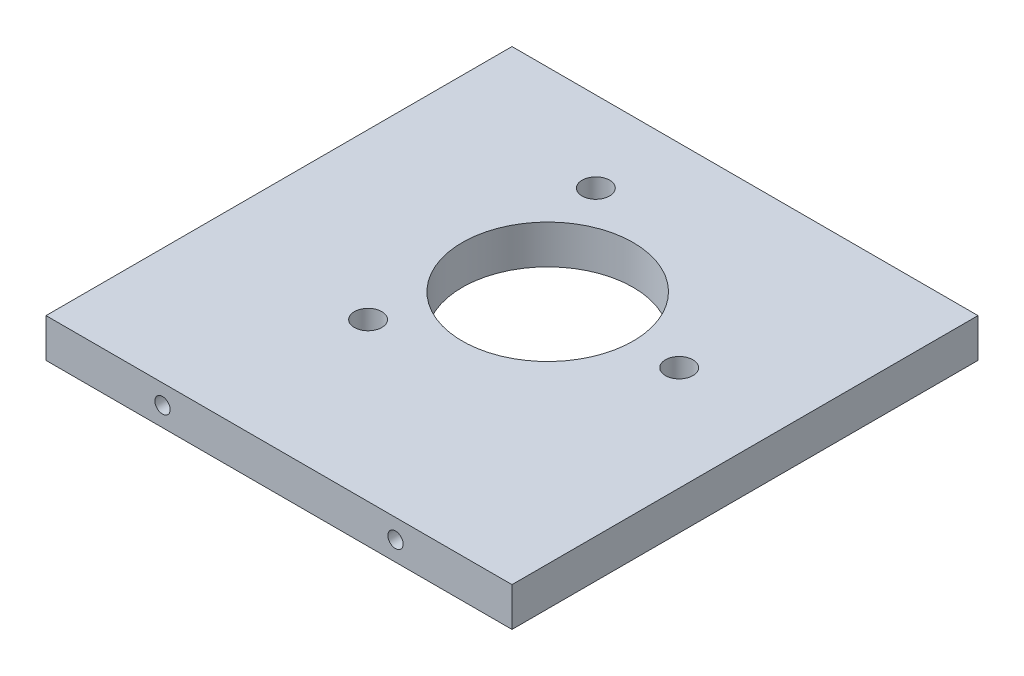
ISO-10303-21;
HEADER;
FILE_DESCRIPTION(('STEP AP214'),'2;1');
FILE_NAME('part.step','',(''),(''),'','','');
FILE_SCHEMA(('AUTOMOTIVE_DESIGN { 1 0 10303 214 1 1 1 1 }'));
ENDSEC;
DATA;
#1=APPLICATION_CONTEXT('core data for automotive mechanical design processes');
#2=APPLICATION_PROTOCOL_DEFINITION('international standard','automotive_design',2000,#1);
#3=PRODUCT_CONTEXT('',#1,'mechanical');
#4=PRODUCT('Part','Part','',(#3));
#5=PRODUCT_RELATED_PRODUCT_CATEGORY('part','',(#4));
#6=PRODUCT_DEFINITION_FORMATION('','',#4);
#7=PRODUCT_DEFINITION_CONTEXT('part definition',#1,'design');
#8=PRODUCT_DEFINITION('design','',#6,#7);
#9=PRODUCT_DEFINITION_SHAPE('','',#8);
#10=(LENGTH_UNIT() NAMED_UNIT(*) SI_UNIT(.MILLI.,.METRE.));
#11=(NAMED_UNIT(*) PLANE_ANGLE_UNIT() SI_UNIT($,.RADIAN.));
#12=(NAMED_UNIT(*) SI_UNIT($,.STERADIAN.) SOLID_ANGLE_UNIT());
#13=UNCERTAINTY_MEASURE_WITH_UNIT(LENGTH_MEASURE(1.E-05),#10,'distance_accuracy_value','');
#14=(GEOMETRIC_REPRESENTATION_CONTEXT(3) GLOBAL_UNCERTAINTY_ASSIGNED_CONTEXT((#13)) GLOBAL_UNIT_ASSIGNED_CONTEXT((#10,
#11,#12)) REPRESENTATION_CONTEXT('',''));
#15=CARTESIAN_POINT('',(0.,0.,0.));
#16=DIRECTION('',(0.,0.,1.));
#17=DIRECTION('',(1.,0.,0.));
#18=AXIS2_PLACEMENT_3D('',#15,#16,#17);
#19=CARTESIAN_POINT('',(-38.1,3.175,76.2));
#20=DIRECTION('',(1.,0.,0.));
#21=DIRECTION('',(0.,0.,-1.));
#22=AXIS2_PLACEMENT_3D('',#19,#20,#21);
#23=PLANE('',#22);
#24=DIRECTION('',(0.,0.,-1.));
#25=VECTOR('',#24,1.);
#26=CARTESIAN_POINT('',(-38.1,3.175,76.2));
#27=LINE('',#26,#25);
#28=CARTESIAN_POINT('',(-38.1,3.175,76.2));
#29=VERTEX_POINT('',#28);
#30=CARTESIAN_POINT('',(-38.1,3.175,0.));
#31=VERTEX_POINT('',#30);
#32=EDGE_CURVE('E150',#29,#31,#27,.T.);
#33=ORIENTED_EDGE('',*,*,#32,.T.);
#34=DIRECTION('',(0.,-1.,0.));
#35=VECTOR('',#34,1.);
#36=CARTESIAN_POINT('',(-38.1,3.175,0.));
#37=LINE('',#36,#35);
#38=CARTESIAN_POINT('',(-38.1,-3.175,0.));
#39=VERTEX_POINT('',#38);
#40=EDGE_CURVE('E51',#31,#39,#37,.T.);
#41=ORIENTED_EDGE('',*,*,#40,.T.);
#42=DIRECTION('',(0.,0.,-1.));
#43=VECTOR('',#42,1.);
#44=CARTESIAN_POINT('',(-38.1,-3.175,76.2));
#45=LINE('',#44,#43);
#46=CARTESIAN_POINT('',(-38.1,-3.175,76.2));
#47=VERTEX_POINT('',#46);
#48=EDGE_CURVE('E11',#47,#39,#45,.T.);
#49=ORIENTED_EDGE('',*,*,#48,.F.);
#50=DIRECTION('',(0.,-1.,0.));
#51=VECTOR('',#50,1.);
#52=CARTESIAN_POINT('',(-38.1,3.175,76.2));
#53=LINE('',#52,#51);
#54=EDGE_CURVE('E141',#29,#47,#53,.T.);
#55=ORIENTED_EDGE('',*,*,#54,.F.);
#56=EDGE_LOOP('',(#33,#41,#49,#55));
#57=FACE_BOUND('',#56,.T.);
#58=ADVANCED_FACE('F37',(#57),#23,.F.);
#59=CARTESIAN_POINT('',(38.1,-3.175,76.2));
#60=DIRECTION('',(0.,1.,0.));
#61=DIRECTION('',(0.,0.,1.));
#62=AXIS2_PLACEMENT_3D('',#59,#60,#61);
#63=PLANE('',#62);
#64=CARTESIAN_POINT('',(-11.2009516410936,-3.175,13.1905201915453));
#65=DIRECTION('',(0.,-1.,0.));
#66=DIRECTION('',(0.,0.,-1.));
#67=AXIS2_PLACEMENT_3D('',#64,#65,#66);
#68=CIRCLE('',#67,4.7);
#69=CARTESIAN_POINT('',(-11.2009516410936,-3.175,8.49052019154533));
#70=VERTEX_POINT('',#69);
#71=EDGE_CURVE('E109',#70,#70,#68,.T.);
#72=ORIENTED_EDGE('',*,*,#71,.F.);
#73=EDGE_LOOP('',(#72));
#74=FACE_BOUND('',#73,.T.);
#75=CARTESIAN_POINT('',(21.0490483589064,-3.175,31.8100663729153));
#76=DIRECTION('',(0.,-1.,0.));
#77=DIRECTION('',(0.,0.,-1.));
#78=AXIS2_PLACEMENT_3D('',#75,#76,#77);
#79=CIRCLE('',#78,4.7);
#80=CARTESIAN_POINT('',(21.0490483589064,-3.175,27.1100663729153));
#81=VERTEX_POINT('',#80);
#82=EDGE_CURVE('E119',#81,#81,#79,.T.);
#83=ORIENTED_EDGE('',*,*,#82,.F.);
#84=EDGE_LOOP('',(#83));
#85=FACE_BOUND('',#84,.T.);
#86=CARTESIAN_POINT('',(-11.2009516410936,-3.175,50.4296125542853));
#87=DIRECTION('',(0.,-1.,0.));
#88=DIRECTION('',(0.,0.,-1.));
#89=AXIS2_PLACEMENT_3D('',#86,#87,#88);
#90=CIRCLE('',#89,4.7);
#91=CARTESIAN_POINT('',(-11.2009516410936,-3.175,45.7296125542853));
#92=VERTEX_POINT('',#91);
#93=EDGE_CURVE('E128',#92,#92,#90,.T.);
#94=ORIENTED_EDGE('',*,*,#93,.F.);
#95=EDGE_LOOP('',(#94));
#96=FACE_BOUND('',#95,.T.);
#97=CARTESIAN_POINT('',(-0.450951641093599,-3.175,31.8100663729154));
#98=DIRECTION('',(0.,-1.,0.));
#99=DIRECTION('',(0.,0.,-1.));
#100=AXIS2_PLACEMENT_3D('',#97,#98,#99);
#101=CIRCLE('',#100,13.9700000001459);
#102=CARTESIAN_POINT('',(-0.450951641093599,-3.175,17.8400663727695));
#103=VERTEX_POINT('',#102);
#104=EDGE_CURVE('E137',#103,#103,#101,.T.);
#105=ORIENTED_EDGE('',*,*,#104,.F.);
#106=EDGE_LOOP('',(#105));
#107=FACE_BOUND('',#106,.T.);
#108=ORIENTED_EDGE('',*,*,#48,.T.);
#109=DIRECTION('',(-1.,0.,0.));
#110=VECTOR('',#109,1.);
#111=CARTESIAN_POINT('',(38.1,-3.175,0.));
#112=LINE('',#111,#110);
#113=CARTESIAN_POINT('',(38.1,-3.175,0.));
#114=VERTEX_POINT('',#113);
#115=EDGE_CURVE('E103',#114,#39,#112,.T.);
#116=ORIENTED_EDGE('',*,*,#115,.F.);
#117=DIRECTION('',(0.,0.,-1.));
#118=VECTOR('',#117,1.);
#119=CARTESIAN_POINT('',(38.1,-3.175,76.2));
#120=LINE('',#119,#118);
#121=CARTESIAN_POINT('',(38.1,-3.175,76.2));
#122=VERTEX_POINT('',#121);
#123=EDGE_CURVE('E44',#122,#114,#120,.T.);
#124=ORIENTED_EDGE('',*,*,#123,.F.);
#125=DIRECTION('',(1.,0.,0.));
#126=VECTOR('',#125,1.);
#127=CARTESIAN_POINT('',(38.1,-3.175,76.2));
#128=LINE('',#127,#126);
#129=EDGE_CURVE('E145',#47,#122,#128,.T.);
#130=ORIENTED_EDGE('',*,*,#129,.F.);
#131=EDGE_LOOP('',(#108,#116,#124,#130));
#132=FACE_BOUND('',#131,.T.);
#133=ADVANCED_FACE('F164',(#74,#85,#96,#107,#132),#63,.F.);
#134=CARTESIAN_POINT('',(38.1,3.175,76.2));
#135=DIRECTION('',(-1.,0.,0.));
#136=DIRECTION('',(0.,0.,1.));
#137=AXIS2_PLACEMENT_3D('',#134,#135,#136);
#138=PLANE('',#137);
#139=ORIENTED_EDGE('',*,*,#123,.T.);
#140=DIRECTION('',(0.,-1.,0.));
#141=VECTOR('',#140,1.);
#142=CARTESIAN_POINT('',(38.1,3.175,0.));
#143=LINE('',#142,#141);
#144=CARTESIAN_POINT('',(38.1,3.175,0.));
#145=VERTEX_POINT('',#144);
#146=EDGE_CURVE('E106',#145,#114,#143,.T.);
#147=ORIENTED_EDGE('',*,*,#146,.F.);
#148=DIRECTION('',(0.,0.,-1.));
#149=VECTOR('',#148,1.);
#150=CARTESIAN_POINT('',(38.1,3.175,76.2));
#151=LINE('',#150,#149);
#152=CARTESIAN_POINT('',(38.1,3.175,76.2));
#153=VERTEX_POINT('',#152);
#154=EDGE_CURVE('E153',#153,#145,#151,.T.);
#155=ORIENTED_EDGE('',*,*,#154,.F.);
#156=DIRECTION('',(0.,1.,0.));
#157=VECTOR('',#156,1.);
#158=CARTESIAN_POINT('',(38.1,3.175,76.2));
#159=LINE('',#158,#157);
#160=EDGE_CURVE('E147',#122,#153,#159,.T.);
#161=ORIENTED_EDGE('',*,*,#160,.F.);
#162=EDGE_LOOP('',(#139,#147,#155,#161));
#163=FACE_BOUND('',#162,.T.);
#164=ADVANCED_FACE('F160',(#163),#138,.F.);
#165=CARTESIAN_POINT('',(38.1,3.175,76.2));
#166=DIRECTION('',(0.,-1.,0.));
#167=DIRECTION('',(0.,0.,-1.));
#168=AXIS2_PLACEMENT_3D('',#165,#166,#167);
#169=PLANE('',#168);
#170=CARTESIAN_POINT('',(-11.2009516410936,3.175,13.1905201915453));
#171=DIRECTION('',(0.,-1.,0.));
#172=DIRECTION('',(0.,0.,-1.));
#173=AXIS2_PLACEMENT_3D('',#170,#171,#172);
#174=CIRCLE('',#173,2.25);
#175=CARTESIAN_POINT('',(-11.2009516410936,3.175,10.9405201915453));
#176=VERTEX_POINT('',#175);
#177=EDGE_CURVE('E116',#176,#176,#174,.T.);
#178=ORIENTED_EDGE('',*,*,#177,.T.);
#179=EDGE_LOOP('',(#178));
#180=FACE_BOUND('',#179,.T.);
#181=CARTESIAN_POINT('',(21.0490483589064,3.175,31.8100663729153));
#182=DIRECTION('',(0.,-1.,0.));
#183=DIRECTION('',(0.,0.,-1.));
#184=AXIS2_PLACEMENT_3D('',#181,#182,#183);
#185=CIRCLE('',#184,2.25);
#186=CARTESIAN_POINT('',(21.0490483589064,3.175,29.5600663729153));
#187=VERTEX_POINT('',#186);
#188=EDGE_CURVE('E125',#187,#187,#185,.T.);
#189=ORIENTED_EDGE('',*,*,#188,.T.);
#190=EDGE_LOOP('',(#189));
#191=FACE_BOUND('',#190,.T.);
#192=CARTESIAN_POINT('',(-11.2009516410936,3.175,50.4296125542853));
#193=DIRECTION('',(0.,-1.,0.));
#194=DIRECTION('',(0.,0.,-1.));
#195=AXIS2_PLACEMENT_3D('',#192,#193,#194);
#196=CIRCLE('',#195,2.25);
#197=CARTESIAN_POINT('',(-11.2009516410936,3.175,48.1796125542853));
#198=VERTEX_POINT('',#197);
#199=EDGE_CURVE('E134',#198,#198,#196,.T.);
#200=ORIENTED_EDGE('',*,*,#199,.T.);
#201=EDGE_LOOP('',(#200));
#202=FACE_BOUND('',#201,.T.);
#203=CARTESIAN_POINT('',(-0.450951641093599,3.175,31.8100663729154));
#204=DIRECTION('',(0.,-1.,0.));
#205=DIRECTION('',(0.,0.,-1.));
#206=AXIS2_PLACEMENT_3D('',#203,#204,#205);
#207=CIRCLE('',#206,13.9700000001459);
#208=CARTESIAN_POINT('',(-0.450951641093599,3.175,17.8400663727695));
#209=VERTEX_POINT('',#208);
#210=EDGE_CURVE('E138',#209,#209,#207,.T.);
#211=ORIENTED_EDGE('',*,*,#210,.T.);
#212=EDGE_LOOP('',(#211));
#213=FACE_BOUND('',#212,.T.);
#214=ORIENTED_EDGE('',*,*,#154,.T.);
#215=DIRECTION('',(-1.,0.,0.));
#216=VECTOR('',#215,1.);
#217=CARTESIAN_POINT('',(38.1,3.175,0.));
#218=LINE('',#217,#216);
#219=EDGE_CURVE('E104',#145,#31,#218,.T.);
#220=ORIENTED_EDGE('',*,*,#219,.T.);
#221=ORIENTED_EDGE('',*,*,#32,.F.);
#222=DIRECTION('',(-1.,0.,0.));
#223=VECTOR('',#222,1.);
#224=CARTESIAN_POINT('',(38.1,3.175,76.2));
#225=LINE('',#224,#223);
#226=EDGE_CURVE('E59',#153,#29,#225,.T.);
#227=ORIENTED_EDGE('',*,*,#226,.F.);
#228=EDGE_LOOP('',(#214,#220,#221,#227));
#229=FACE_BOUND('',#228,.T.);
#230=ADVANCED_FACE('F170',(#180,#191,#202,#213,#229),#169,.F.);
#231=CARTESIAN_POINT('',(0.,0.,76.2));
#232=DIRECTION('',(0.,0.,-1.));
#233=DIRECTION('',(-1.,0.,0.));
#234=AXIS2_PLACEMENT_3D('',#231,#232,#233);
#235=PLANE('',#234);
#236=CARTESIAN_POINT('',(19.05,0.,76.2));
#237=DIRECTION('',(0.,0.,1.));
#238=DIRECTION('',(1.,0.,0.));
#239=AXIS2_PLACEMENT_3D('',#236,#237,#238);
#240=CIRCLE('',#239,1.24999999999999);
#241=CARTESIAN_POINT('',(20.3,0.,76.2));
#242=VERTEX_POINT('',#241);
#243=EDGE_CURVE('E93',#242,#242,#240,.T.);
#244=ORIENTED_EDGE('',*,*,#243,.F.);
#245=EDGE_LOOP('',(#244));
#246=FACE_BOUND('',#245,.T.);
#247=CARTESIAN_POINT('',(-19.05,0.,76.2));
#248=DIRECTION('',(0.,0.,1.));
#249=DIRECTION('',(1.,0.,0.));
#250=AXIS2_PLACEMENT_3D('',#247,#248,#249);
#251=CIRCLE('',#250,1.24999999999999);
#252=CARTESIAN_POINT('',(-17.8,0.,76.2));
#253=VERTEX_POINT('',#252);
#254=EDGE_CURVE('E92',#253,#253,#251,.T.);
#255=ORIENTED_EDGE('',*,*,#254,.F.);
#256=EDGE_LOOP('',(#255));
#257=FACE_BOUND('',#256,.T.);
#258=ORIENTED_EDGE('',*,*,#54,.T.);
#259=ORIENTED_EDGE('',*,*,#129,.T.);
#260=ORIENTED_EDGE('',*,*,#160,.T.);
#261=ORIENTED_EDGE('',*,*,#226,.T.);
#262=EDGE_LOOP('',(#258,#259,#260,#261));
#263=FACE_BOUND('',#262,.T.);
#264=ADVANCED_FACE('F172',(#246,#257,#263),#235,.F.);
#265=CARTESIAN_POINT('',(-0.450951641093599,3.175,31.8100663729154));
#266=DIRECTION('',(0.,-1.,0.));
#267=DIRECTION('',(0.,0.,-1.));
#268=AXIS2_PLACEMENT_3D('',#265,#266,#267);
#269=CYLINDRICAL_SURFACE('',#268,13.9700000001459);
#270=ORIENTED_EDGE('',*,*,#210,.F.);
#271=EDGE_LOOP('',(#270));
#272=FACE_BOUND('',#271,.T.);
#273=ORIENTED_EDGE('',*,*,#104,.T.);
#274=EDGE_LOOP('',(#273));
#275=FACE_BOUND('',#274,.T.);
#276=ADVANCED_FACE('F179',(#272,#275),#269,.F.);
#277=CARTESIAN_POINT('',(-11.2009516410936,-3.175,50.4296125542853));
#278=DIRECTION('',(0.,-1.,0.));
#279=DIRECTION('',(0.,0.,-1.));
#280=AXIS2_PLACEMENT_3D('',#277,#278,#279);
#281=CYLINDRICAL_SURFACE('',#280,2.25);
#282=ORIENTED_EDGE('',*,*,#199,.F.);
#283=EDGE_LOOP('',(#282));
#284=FACE_BOUND('',#283,.T.);
#285=CARTESIAN_POINT('',(-11.2009516410936,-0.725000000000001,50.4296125542853));
#286=DIRECTION('',(0.,-1.,0.));
#287=DIRECTION('',(0.,0.,-1.));
#288=AXIS2_PLACEMENT_3D('',#285,#286,#287);
#289=CIRCLE('',#288,2.25);
#290=CARTESIAN_POINT('',(-11.2009516410936,-0.725000000000001,48.1796125542853));
#291=VERTEX_POINT('',#290);
#292=EDGE_CURVE('E131',#291,#291,#289,.T.);
#293=ORIENTED_EDGE('',*,*,#292,.T.);
#294=EDGE_LOOP('',(#293));
#295=FACE_BOUND('',#294,.T.);
#296=ADVANCED_FACE('F200',(#284,#295),#281,.F.);
#297=CARTESIAN_POINT('',(-11.2009516410936,-3.175,50.4296125542853));
#298=DIRECTION('',(0.,-1.,0.));
#299=DIRECTION('',(0.,0.,-1.));
#300=AXIS2_PLACEMENT_3D('',#297,#298,#299);
#301=CONICAL_SURFACE('',#300,4.7,0.785398163397449);
#302=ORIENTED_EDGE('',*,*,#292,.F.);
#303=EDGE_LOOP('',(#302));
#304=FACE_BOUND('',#303,.T.);
#305=ORIENTED_EDGE('',*,*,#93,.T.);
#306=EDGE_LOOP('',(#305));
#307=FACE_BOUND('',#306,.T.);
#308=ADVANCED_FACE('F206',(#304,#307),#301,.F.);
#309=CARTESIAN_POINT('',(21.0490483589064,-3.175,31.8100663729153));
#310=DIRECTION('',(0.,-1.,0.));
#311=DIRECTION('',(0.,0.,-1.));
#312=AXIS2_PLACEMENT_3D('',#309,#310,#311);
#313=CYLINDRICAL_SURFACE('',#312,2.25);
#314=ORIENTED_EDGE('',*,*,#188,.F.);
#315=EDGE_LOOP('',(#314));
#316=FACE_BOUND('',#315,.T.);
#317=CARTESIAN_POINT('',(21.0490483589064,-0.725000000000001,31.8100663729153));
#318=DIRECTION('',(0.,-1.,0.));
#319=DIRECTION('',(0.,0.,-1.));
#320=AXIS2_PLACEMENT_3D('',#317,#318,#319);
#321=CIRCLE('',#320,2.25);
#322=CARTESIAN_POINT('',(21.0490483589064,-0.725000000000001,29.5600663729153));
#323=VERTEX_POINT('',#322);
#324=EDGE_CURVE('E122',#323,#323,#321,.T.);
#325=ORIENTED_EDGE('',*,*,#324,.T.);
#326=EDGE_LOOP('',(#325));
#327=FACE_BOUND('',#326,.T.);
#328=ADVANCED_FACE('F213',(#316,#327),#313,.F.);
#329=CARTESIAN_POINT('',(21.0490483589064,-3.175,31.8100663729153));
#330=DIRECTION('',(0.,-1.,0.));
#331=DIRECTION('',(0.,0.,-1.));
#332=AXIS2_PLACEMENT_3D('',#329,#330,#331);
#333=CONICAL_SURFACE('',#332,4.7,0.785398163397449);
#334=ORIENTED_EDGE('',*,*,#324,.F.);
#335=EDGE_LOOP('',(#334));
#336=FACE_BOUND('',#335,.T.);
#337=ORIENTED_EDGE('',*,*,#82,.T.);
#338=EDGE_LOOP('',(#337));
#339=FACE_BOUND('',#338,.T.);
#340=ADVANCED_FACE('F217',(#336,#339),#333,.F.);
#341=CARTESIAN_POINT('',(-11.2009516410936,-3.175,13.1905201915453));
#342=DIRECTION('',(0.,-1.,0.));
#343=DIRECTION('',(0.,0.,-1.));
#344=AXIS2_PLACEMENT_3D('',#341,#342,#343);
#345=CYLINDRICAL_SURFACE('',#344,2.25);
#346=ORIENTED_EDGE('',*,*,#177,.F.);
#347=EDGE_LOOP('',(#346));
#348=FACE_BOUND('',#347,.T.);
#349=CARTESIAN_POINT('',(-11.2009516410936,-0.725000000000001,13.1905201915453));
#350=DIRECTION('',(0.,-1.,0.));
#351=DIRECTION('',(0.,0.,-1.));
#352=AXIS2_PLACEMENT_3D('',#349,#350,#351);
#353=CIRCLE('',#352,2.25);
#354=CARTESIAN_POINT('',(-11.2009516410936,-0.725000000000001,10.9405201915453));
#355=VERTEX_POINT('',#354);
#356=EDGE_CURVE('E113',#355,#355,#353,.T.);
#357=ORIENTED_EDGE('',*,*,#356,.T.);
#358=EDGE_LOOP('',(#357));
#359=FACE_BOUND('',#358,.T.);
#360=ADVANCED_FACE('F221',(#348,#359),#345,.F.);
#361=CARTESIAN_POINT('',(-11.2009516410936,-3.175,13.1905201915453));
#362=DIRECTION('',(0.,-1.,0.));
#363=DIRECTION('',(0.,0.,-1.));
#364=AXIS2_PLACEMENT_3D('',#361,#362,#363);
#365=CONICAL_SURFACE('',#364,4.7,0.785398163397449);
#366=ORIENTED_EDGE('',*,*,#356,.F.);
#367=EDGE_LOOP('',(#366));
#368=FACE_BOUND('',#367,.T.);
#369=ORIENTED_EDGE('',*,*,#71,.T.);
#370=EDGE_LOOP('',(#369));
#371=FACE_BOUND('',#370,.T.);
#372=ADVANCED_FACE('F225',(#368,#371),#365,.F.);
#373=CARTESIAN_POINT('',(38.1,3.175,0.));
#374=DIRECTION('',(0.,0.,1.));
#375=DIRECTION('',(1.,0.,0.));
#376=AXIS2_PLACEMENT_3D('',#373,#374,#375);
#377=PLANE('',#376);
#378=ORIENTED_EDGE('',*,*,#115,.T.);
#379=ORIENTED_EDGE('',*,*,#40,.F.);
#380=ORIENTED_EDGE('',*,*,#219,.F.);
#381=ORIENTED_EDGE('',*,*,#146,.T.);
#382=EDGE_LOOP('',(#378,#379,#380,#381));
#383=FACE_BOUND('',#382,.T.);
#384=ADVANCED_FACE('F166',(#383),#377,.F.);
#385=CARTESIAN_POINT('',(-19.05,0.,64.2510757737845));
#386=DIRECTION('',(0.,0.,1.));
#387=DIRECTION('',(1.,0.,0.));
#388=AXIS2_PLACEMENT_3D('',#385,#386,#387);
#389=CONICAL_SURFACE('',#388,1.25,1.02974425867665);
#390=CARTESIAN_POINT('',(-19.05,0.,63.5));
#391=VERTEX_POINT('',#390);
#392=VERTEX_LOOP('',#391);
#393=FACE_BOUND('',#392,.T.);
#394=CARTESIAN_POINT('',(-19.05,0.,64.2510757737845));
#395=DIRECTION('',(0.,0.,1.));
#396=DIRECTION('',(1.,0.,0.));
#397=AXIS2_PLACEMENT_3D('',#394,#395,#396);
#398=CIRCLE('',#397,1.25);
#399=CARTESIAN_POINT('',(-17.8,0.,64.2510757737845));
#400=VERTEX_POINT('',#399);
#401=EDGE_CURVE('E96',#400,#400,#398,.T.);
#402=ORIENTED_EDGE('',*,*,#401,.T.);
#403=EDGE_LOOP('',(#402));
#404=FACE_BOUND('',#403,.T.);
#405=ADVANCED_FACE('F232',(#393,#404),#389,.F.);
#406=CARTESIAN_POINT('',(-19.05,0.,76.2));
#407=DIRECTION('',(0.,0.,1.));
#408=DIRECTION('',(1.,0.,0.));
#409=AXIS2_PLACEMENT_3D('',#406,#407,#408);
#410=CYLINDRICAL_SURFACE('',#409,1.24999999999999);
#411=ORIENTED_EDGE('',*,*,#401,.F.);
#412=EDGE_LOOP('',(#411));
#413=FACE_BOUND('',#412,.T.);
#414=ORIENTED_EDGE('',*,*,#254,.T.);
#415=EDGE_LOOP('',(#414));
#416=FACE_BOUND('',#415,.T.);
#417=ADVANCED_FACE('F86',(#413,#416),#410,.F.);
#418=CARTESIAN_POINT('',(19.05,0.,64.2510757737845));
#419=DIRECTION('',(0.,0.,1.));
#420=DIRECTION('',(1.,0.,0.));
#421=AXIS2_PLACEMENT_3D('',#418,#419,#420);
#422=CONICAL_SURFACE('',#421,1.25,1.02974425867665);
#423=CARTESIAN_POINT('',(19.05,0.,63.5));
#424=VERTEX_POINT('',#423);
#425=VERTEX_LOOP('',#424);
#426=FACE_BOUND('',#425,.T.);
#427=CARTESIAN_POINT('',(19.05,0.,64.2510757737845));
#428=DIRECTION('',(0.,0.,1.));
#429=DIRECTION('',(1.,0.,0.));
#430=AXIS2_PLACEMENT_3D('',#427,#428,#429);
#431=CIRCLE('',#430,1.25);
#432=CARTESIAN_POINT('',(20.3,0.,64.2510757737845));
#433=VERTEX_POINT('',#432);
#434=EDGE_CURVE('E90',#433,#433,#431,.T.);
#435=ORIENTED_EDGE('',*,*,#434,.T.);
#436=EDGE_LOOP('',(#435));
#437=FACE_BOUND('',#436,.T.);
#438=ADVANCED_FACE('F82',(#426,#437),#422,.F.);
#439=CARTESIAN_POINT('',(19.05,0.,76.2));
#440=DIRECTION('',(0.,0.,1.));
#441=DIRECTION('',(1.,0.,0.));
#442=AXIS2_PLACEMENT_3D('',#439,#440,#441);
#443=CYLINDRICAL_SURFACE('',#442,1.24999999999999);
#444=ORIENTED_EDGE('',*,*,#434,.F.);
#445=EDGE_LOOP('',(#444));
#446=FACE_BOUND('',#445,.T.);
#447=ORIENTED_EDGE('',*,*,#243,.T.);
#448=EDGE_LOOP('',(#447));
#449=FACE_BOUND('',#448,.T.);
#450=ADVANCED_FACE('F85',(#446,#449),#443,.F.);
#451=CLOSED_SHELL('',(#58,#133,#164,#230,#264,#276,#296,#308,#328,#340,#360,#372,#384,#405,#417,
#438,#450));
#452=MANIFOLD_SOLID_BREP('B2',#451);
#453=ADVANCED_BREP_SHAPE_REPRESENTATION('',(#18,#452),#14);
#454=SHAPE_DEFINITION_REPRESENTATION(#9,#453);
ENDSEC;
END-ISO-10303-21;
